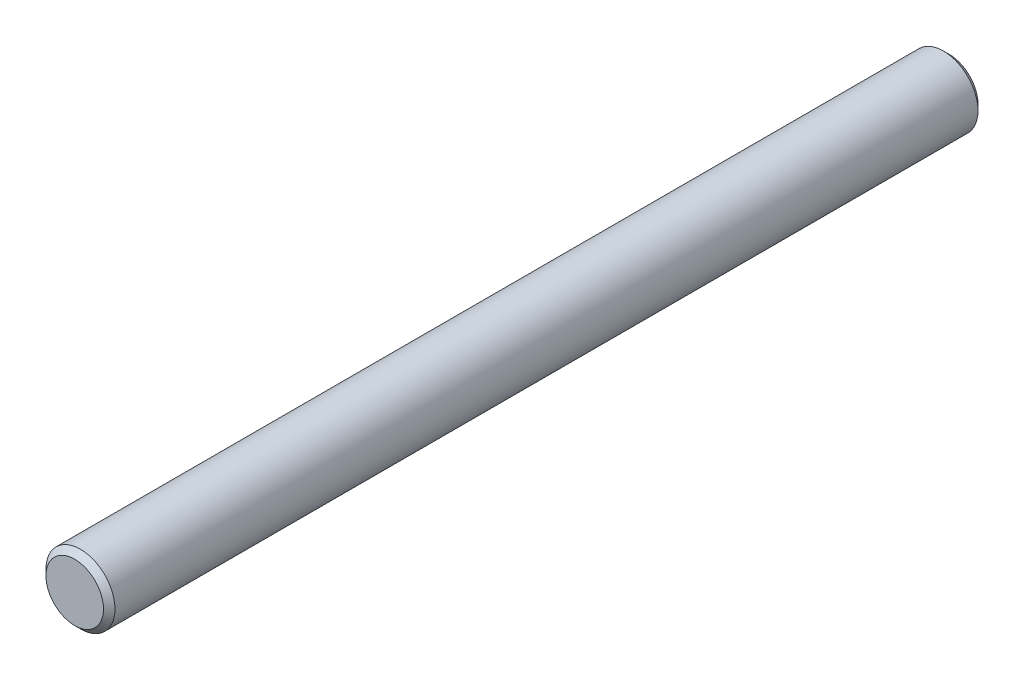
ISO-10303-21;
HEADER;
FILE_DESCRIPTION(('STEP AP214'),'2;1');
FILE_NAME('part.step','',(''),(''),'','','');
FILE_SCHEMA(('AUTOMOTIVE_DESIGN { 1 0 10303 214 1 1 1 1 }'));
ENDSEC;
DATA;
#1=APPLICATION_CONTEXT('core data for automotive mechanical design processes');
#2=APPLICATION_PROTOCOL_DEFINITION('international standard','automotive_design',2000,#1);
#3=PRODUCT_CONTEXT('',#1,'mechanical');
#4=PRODUCT('Part','Part','',(#3));
#5=PRODUCT_RELATED_PRODUCT_CATEGORY('part','',(#4));
#6=PRODUCT_DEFINITION_FORMATION('','',#4);
#7=PRODUCT_DEFINITION_CONTEXT('part definition',#1,'design');
#8=PRODUCT_DEFINITION('design','',#6,#7);
#9=PRODUCT_DEFINITION_SHAPE('','',#8);
#10=(LENGTH_UNIT() NAMED_UNIT(*) SI_UNIT(.MILLI.,.METRE.));
#11=(NAMED_UNIT(*) PLANE_ANGLE_UNIT() SI_UNIT($,.RADIAN.));
#12=(NAMED_UNIT(*) SI_UNIT($,.STERADIAN.) SOLID_ANGLE_UNIT());
#13=UNCERTAINTY_MEASURE_WITH_UNIT(LENGTH_MEASURE(1.E-05),#10,'distance_accuracy_value','');
#14=(GEOMETRIC_REPRESENTATION_CONTEXT(3) GLOBAL_UNCERTAINTY_ASSIGNED_CONTEXT((#13)) GLOBAL_UNIT_ASSIGNED_CONTEXT((#10,
#11,#12)) REPRESENTATION_CONTEXT('',''));
#15=CARTESIAN_POINT('',(0.,0.,0.));
#16=DIRECTION('',(0.,0.,1.));
#17=DIRECTION('',(1.,0.,0.));
#18=AXIS2_PLACEMENT_3D('',#15,#16,#17);
#19=CARTESIAN_POINT('',(0.,0.,38.));
#20=DIRECTION('',(0.,0.,-1.));
#21=DIRECTION('',(-1.,0.,0.));
#22=AXIS2_PLACEMENT_3D('',#19,#20,#21);
#23=CYLINDRICAL_SURFACE('',#22,1.5);
#24=CARTESIAN_POINT('',(0.,0.,37.75));
#25=DIRECTION('',(0.,0.,1.));
#26=DIRECTION('',(1.,0.,0.));
#27=AXIS2_PLACEMENT_3D('',#24,#25,#26);
#28=CIRCLE('',#27,1.5);
#29=CARTESIAN_POINT('',(1.5,0.,37.75));
#30=VERTEX_POINT('',#29);
#31=EDGE_CURVE('E48',#30,#30,#28,.F.);
#32=ORIENTED_EDGE('',*,*,#31,.T.);
#33=EDGE_LOOP('',(#32));
#34=FACE_BOUND('',#33,.T.);
#35=CARTESIAN_POINT('',(0.,0.,0.25));
#36=DIRECTION('',(0.,0.,1.));
#37=DIRECTION('',(1.,0.,0.));
#38=AXIS2_PLACEMENT_3D('',#35,#36,#37);
#39=CIRCLE('',#38,1.5);
#40=CARTESIAN_POINT('',(1.5,0.,0.25));
#41=VERTEX_POINT('',#40);
#42=EDGE_CURVE('E53',#41,#41,#39,.T.);
#43=ORIENTED_EDGE('',*,*,#42,.T.);
#44=EDGE_LOOP('',(#43));
#45=FACE_BOUND('',#44,.T.);
#46=ADVANCED_FACE('F39',(#34,#45),#23,.T.);
#47=CARTESIAN_POINT('',(0.,0.,38.));
#48=DIRECTION('',(0.,0.,1.));
#49=DIRECTION('',(1.,0.,0.));
#50=AXIS2_PLACEMENT_3D('',#47,#48,#49);
#51=PLANE('',#50);
#52=CARTESIAN_POINT('',(0.,0.,38.));
#53=DIRECTION('',(0.,0.,1.));
#54=DIRECTION('',(1.,0.,0.));
#55=AXIS2_PLACEMENT_3D('',#52,#53,#54);
#56=CIRCLE('',#55,1.25);
#57=CARTESIAN_POINT('',(1.25,0.,38.));
#58=VERTEX_POINT('',#57);
#59=EDGE_CURVE('E58',#58,#58,#56,.T.);
#60=ORIENTED_EDGE('',*,*,#59,.T.);
#61=EDGE_LOOP('',(#60));
#62=FACE_BOUND('',#61,.T.);
#63=ADVANCED_FACE('F65',(#62),#51,.T.);
#64=CARTESIAN_POINT('',(0.,0.,0.));
#65=DIRECTION('',(0.,0.,1.));
#66=DIRECTION('',(1.,0.,0.));
#67=AXIS2_PLACEMENT_3D('',#64,#65,#66);
#68=PLANE('',#67);
#69=CARTESIAN_POINT('',(0.,0.,0.));
#70=DIRECTION('',(0.,0.,1.));
#71=DIRECTION('',(1.,0.,0.));
#72=AXIS2_PLACEMENT_3D('',#69,#70,#71);
#73=CIRCLE('',#72,1.25);
#74=CARTESIAN_POINT('',(1.25,0.,0.));
#75=VERTEX_POINT('',#74);
#76=EDGE_CURVE('E10',#75,#75,#73,.F.);
#77=ORIENTED_EDGE('',*,*,#76,.T.);
#78=EDGE_LOOP('',(#77));
#79=FACE_BOUND('',#78,.T.);
#80=ADVANCED_FACE('F69',(#79),#68,.F.);
#81=CARTESIAN_POINT('',(0.,0.,38.));
#82=DIRECTION('',(0.,0.,-1.));
#83=DIRECTION('',(-1.,0.,0.));
#84=AXIS2_PLACEMENT_3D('',#81,#82,#83);
#85=CONICAL_SURFACE('',#84,1.25,0.785398163397452);
#86=ORIENTED_EDGE('',*,*,#31,.F.);
#87=EDGE_LOOP('',(#86));
#88=FACE_BOUND('',#87,.T.);
#89=ORIENTED_EDGE('',*,*,#59,.F.);
#90=EDGE_LOOP('',(#89));
#91=FACE_BOUND('',#90,.T.);
#92=ADVANCED_FACE('F67',(#88,#91),#85,.T.);
#93=CARTESIAN_POINT('',(0.,0.,0.25));
#94=DIRECTION('',(0.,0.,1.));
#95=DIRECTION('',(1.,0.,0.));
#96=AXIS2_PLACEMENT_3D('',#93,#94,#95);
#97=CONICAL_SURFACE('',#96,1.5,0.785398163397445);
#98=ORIENTED_EDGE('',*,*,#76,.F.);
#99=EDGE_LOOP('',(#98));
#100=FACE_BOUND('',#99,.T.);
#101=ORIENTED_EDGE('',*,*,#42,.F.);
#102=EDGE_LOOP('',(#101));
#103=FACE_BOUND('',#102,.T.);
#104=ADVANCED_FACE('F42',(#100,#103),#97,.T.);
#105=CLOSED_SHELL('',(#46,#63,#80,#92,#104));
#106=MANIFOLD_SOLID_BREP('B2',#105);
#107=ADVANCED_BREP_SHAPE_REPRESENTATION('',(#18,#106),#14);
#108=SHAPE_DEFINITION_REPRESENTATION(#9,#107);
ENDSEC;
END-ISO-10303-21;
